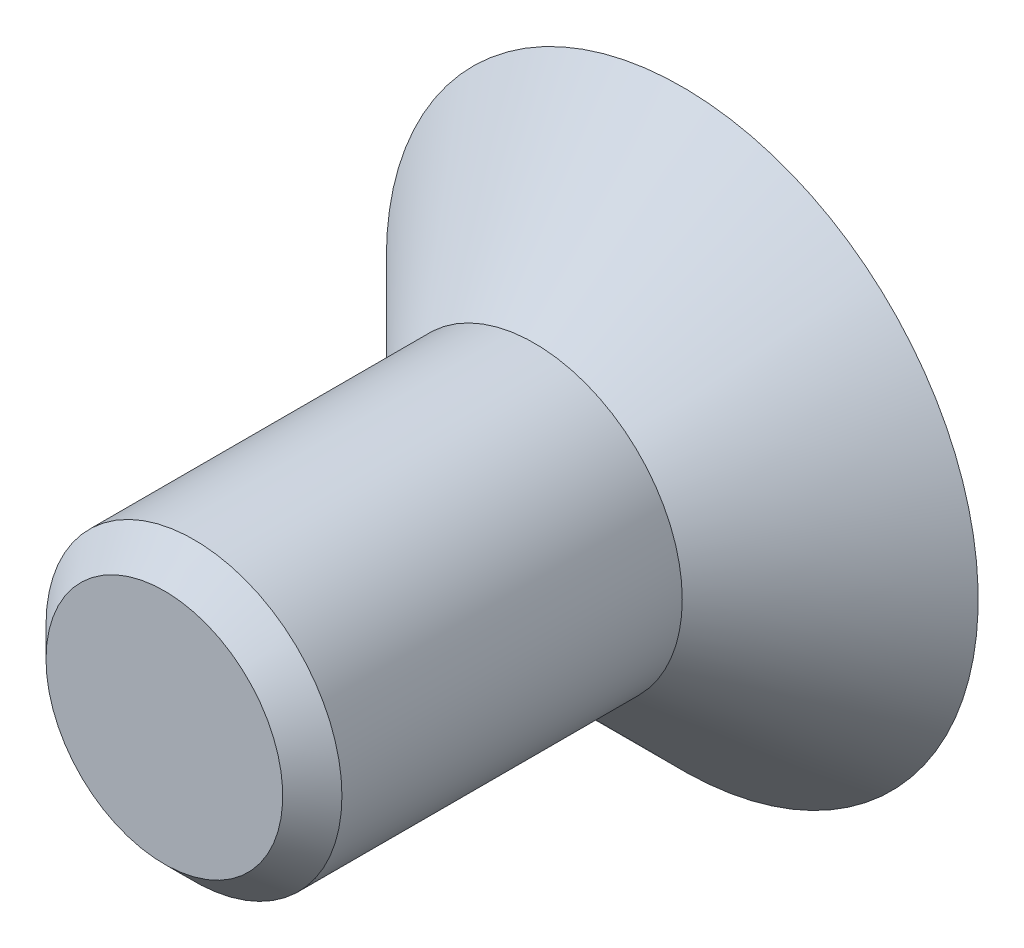
ISO-10303-21;
HEADER;
FILE_DESCRIPTION(('STEP AP214'),'2;1');
FILE_NAME('part.step','',(''),(''),'','','');
FILE_SCHEMA(('AUTOMOTIVE_DESIGN { 1 0 10303 214 1 1 1 1 }'));
ENDSEC;
DATA;
#1=APPLICATION_CONTEXT('core data for automotive mechanical design processes');
#2=APPLICATION_PROTOCOL_DEFINITION('international standard','automotive_design',2000,#1);
#3=PRODUCT_CONTEXT('',#1,'mechanical');
#4=PRODUCT('Part','Part','',(#3));
#5=PRODUCT_RELATED_PRODUCT_CATEGORY('part','',(#4));
#6=PRODUCT_DEFINITION_FORMATION('','',#4);
#7=PRODUCT_DEFINITION_CONTEXT('part definition',#1,'design');
#8=PRODUCT_DEFINITION('design','',#6,#7);
#9=PRODUCT_DEFINITION_SHAPE('','',#8);
#10=(LENGTH_UNIT() NAMED_UNIT(*) SI_UNIT(.MILLI.,.METRE.));
#11=(NAMED_UNIT(*) PLANE_ANGLE_UNIT() SI_UNIT($,.RADIAN.));
#12=(NAMED_UNIT(*) SI_UNIT($,.STERADIAN.) SOLID_ANGLE_UNIT());
#13=UNCERTAINTY_MEASURE_WITH_UNIT(LENGTH_MEASURE(1.E-05),#10,'distance_accuracy_value','');
#14=(GEOMETRIC_REPRESENTATION_CONTEXT(3) GLOBAL_UNCERTAINTY_ASSIGNED_CONTEXT((#13)) GLOBAL_UNIT_ASSIGNED_CONTEXT((#10,
#11,#12)) REPRESENTATION_CONTEXT('',''));
#15=CARTESIAN_POINT('',(0.,0.,0.));
#16=DIRECTION('',(0.,0.,1.));
#17=DIRECTION('',(1.,0.,0.));
#18=AXIS2_PLACEMENT_3D('',#15,#16,#17);
#19=CARTESIAN_POINT('',(0.,0.,14.));
#20=DIRECTION('',(0.,0.,1.));
#21=DIRECTION('',(1.,0.,0.));
#22=AXIS2_PLACEMENT_3D('',#19,#20,#21);
#23=PLANE('',#22);
#24=CARTESIAN_POINT('',(0.,0.,14.00000000001));
#25=DIRECTION('',(0.,0.,-1.));
#26=DIRECTION('',(-1.,0.,0.));
#27=AXIS2_PLACEMENT_3D('',#24,#25,#26);
#28=CIRCLE('',#27,3.1999999999357);
#29=CARTESIAN_POINT('',(-3.1999999999357,0.,14.00000000001));
#30=VERTEX_POINT('',#29);
#31=EDGE_CURVE('E20',#30,#30,#28,.T.);
#32=ORIENTED_EDGE('',*,*,#31,.F.);
#33=EDGE_LOOP('',(#32));
#34=FACE_BOUND('',#33,.T.);
#35=ADVANCED_FACE('F17',(#34),#23,.T.);
#36=CARTESIAN_POINT('',(0.,0.,13.2000000000403));
#37=DIRECTION('',(0.,0.,-1.));
#38=DIRECTION('',(-1.,0.,0.));
#39=AXIS2_PLACEMENT_3D('',#36,#37,#38);
#40=CONICAL_SURFACE('',#39,3.99999999990541,0.785398163397448);
#41=CARTESIAN_POINT('',(0.,0.,13.2));
#42=DIRECTION('',(0.,0.,1.));
#43=DIRECTION('',(1.,0.,0.));
#44=AXIS2_PLACEMENT_3D('',#41,#42,#43);
#45=CIRCLE('',#44,4.);
#46=CARTESIAN_POINT('',(4.,0.,13.2));
#47=VERTEX_POINT('',#46);
#48=EDGE_CURVE('E103',#47,#47,#45,.F.);
#49=ORIENTED_EDGE('',*,*,#48,.F.);
#50=EDGE_LOOP('',(#49));
#51=FACE_BOUND('',#50,.T.);
#52=ORIENTED_EDGE('',*,*,#31,.T.);
#53=EDGE_LOOP('',(#52));
#54=FACE_BOUND('',#53,.T.);
#55=ADVANCED_FACE('F192',(#51,#54),#40,.T.);
#56=CARTESIAN_POINT('',(0.,0.,0.));
#57=DIRECTION('',(0.,0.,1.));
#58=DIRECTION('',(1.,0.,0.));
#59=AXIS2_PLACEMENT_3D('',#56,#57,#58);
#60=CYLINDRICAL_SURFACE('',#59,4.);
#61=ORIENTED_EDGE('',*,*,#48,.T.);
#62=EDGE_LOOP('',(#61));
#63=FACE_BOUND('',#62,.T.);
#64=CARTESIAN_POINT('',(0.,0.,4.));
#65=DIRECTION('',(0.,0.,-1.));
#66=DIRECTION('',(0.,-1.,0.));
#67=AXIS2_PLACEMENT_3D('',#64,#65,#66);
#68=CIRCLE('',#67,4.);
#69=CARTESIAN_POINT('',(0.,-4.,4.));
#70=VERTEX_POINT('',#69);
#71=EDGE_CURVE('E80',#70,#70,#68,.T.);
#72=ORIENTED_EDGE('',*,*,#71,.F.);
#73=EDGE_LOOP('',(#72));
#74=FACE_BOUND('',#73,.T.);
#75=ADVANCED_FACE('F190',(#63,#74),#60,.T.);
#76=CARTESIAN_POINT('',(0.,0.,4.));
#77=DIRECTION('',(0.,0.,1.));
#78=DIRECTION('',(1.,0.,0.));
#79=AXIS2_PLACEMENT_3D('',#76,#77,#78);
#80=PLANE('',#79);
#81=DIRECTION('',(-0.866025403784439,-0.5,0.));
#82=VECTOR('',#81,1.);
#83=CARTESIAN_POINT('',(-2.5,1.44337567297406,4.));
#84=LINE('',#83,#82);
#85=CARTESIAN_POINT('',(-2.5,1.44337567297406,4.));
#86=VERTEX_POINT('',#85);
#87=CARTESIAN_POINT('',(0.,2.88675134594813,4.));
#88=VERTEX_POINT('',#87);
#89=EDGE_CURVE('E130',#86,#88,#84,.F.);
#90=ORIENTED_EDGE('',*,*,#89,.T.);
#91=DIRECTION('',(-0.866025403784439,0.5,0.));
#92=VECTOR('',#91,1.);
#93=CARTESIAN_POINT('',(0.,2.88675134594813,4.));
#94=LINE('',#93,#92);
#95=CARTESIAN_POINT('',(2.5,1.44337567297406,4.));
#96=VERTEX_POINT('',#95);
#97=EDGE_CURVE('E123',#88,#96,#94,.F.);
#98=ORIENTED_EDGE('',*,*,#97,.T.);
#99=DIRECTION('',(0.,1.,0.));
#100=VECTOR('',#99,1.);
#101=CARTESIAN_POINT('',(2.5,1.44337567297406,4.));
#102=LINE('',#101,#100);
#103=CARTESIAN_POINT('',(2.5,-1.44337567297406,4.));
#104=VERTEX_POINT('',#103);
#105=EDGE_CURVE('E73',#96,#104,#102,.F.);
#106=ORIENTED_EDGE('',*,*,#105,.T.);
#107=DIRECTION('',(0.866025403784439,0.499999999999999,0.));
#108=VECTOR('',#107,1.);
#109=CARTESIAN_POINT('',(2.5,-1.44337567297406,4.));
#110=LINE('',#109,#108);
#111=CARTESIAN_POINT('',(0.,-2.88675134594813,4.));
#112=VERTEX_POINT('',#111);
#113=EDGE_CURVE('E71',#104,#112,#110,.F.);
#114=ORIENTED_EDGE('',*,*,#113,.T.);
#115=DIRECTION('',(0.866025403784438,-0.5,0.));
#116=VECTOR('',#115,1.);
#117=CARTESIAN_POINT('',(0.,-2.88675134594813,4.));
#118=LINE('',#117,#116);
#119=CARTESIAN_POINT('',(-2.5,-1.44337567297406,4.));
#120=VERTEX_POINT('',#119);
#121=EDGE_CURVE('E68',#112,#120,#118,.F.);
#122=ORIENTED_EDGE('',*,*,#121,.T.);
#123=DIRECTION('',(0.,1.,0.));
#124=VECTOR('',#123,1.);
#125=CARTESIAN_POINT('',(-2.5,-1.44337567297406,4.));
#126=LINE('',#125,#124);
#127=EDGE_CURVE('E137',#120,#86,#126,.T.);
#128=ORIENTED_EDGE('',*,*,#127,.T.);
#129=EDGE_LOOP('',(#90,#98,#106,#114,#122,#128));
#130=FACE_BOUND('',#129,.T.);
#131=ADVANCED_FACE('F72',(#130),#80,.F.);
#132=CARTESIAN_POINT('',(0.,0.,0.));
#133=DIRECTION('',(0.,0.,-1.));
#134=DIRECTION('',(-1.,0.,0.));
#135=AXIS2_PLACEMENT_3D('',#132,#133,#134);
#136=CONICAL_SURFACE('',#135,8.,0.785398163397448);
#137=CARTESIAN_POINT('',(0.,0.,0.));
#138=DIRECTION('',(0.,0.,-1.));
#139=DIRECTION('',(-1.,0.,0.));
#140=AXIS2_PLACEMENT_3D('',#137,#138,#139);
#141=CIRCLE('',#140,8.);
#142=CARTESIAN_POINT('',(-8.,0.,0.));
#143=VERTEX_POINT('',#142);
#144=EDGE_CURVE('E106',#143,#143,#141,.F.);
#145=ORIENTED_EDGE('',*,*,#144,.T.);
#146=EDGE_LOOP('',(#145));
#147=FACE_BOUND('',#146,.T.);
#148=ORIENTED_EDGE('',*,*,#71,.T.);
#149=EDGE_LOOP('',(#148));
#150=FACE_BOUND('',#149,.T.);
#151=ADVANCED_FACE('F185',(#147,#150),#136,.T.);
#152=CARTESIAN_POINT('',(2.5,-1.44337567297406,0.));
#153=DIRECTION('',(0.499999999999999,-0.866025403784439,0.));
#154=DIRECTION('',(0.866025403784439,0.499999999999999,0.));
#155=AXIS2_PLACEMENT_3D('',#152,#153,#154);
#156=PLANE('',#155);
#157=ORIENTED_EDGE('',*,*,#113,.F.);
#158=DIRECTION('',(0.,0.,-1.));
#159=VECTOR('',#158,1.);
#160=CARTESIAN_POINT('',(2.5,-1.44337567297406,0.));
#161=LINE('',#160,#159);
#162=CARTESIAN_POINT('',(2.5,-1.44337567297406,0.));
#163=VERTEX_POINT('',#162);
#164=EDGE_CURVE('E109',#104,#163,#161,.T.);
#165=ORIENTED_EDGE('',*,*,#164,.T.);
#166=DIRECTION('',(-0.866025403784438,-0.500000000000001,0.));
#167=VECTOR('',#166,1.);
#168=CARTESIAN_POINT('',(2.5,-1.44337567297406,0.));
#169=LINE('',#168,#167);
#170=CARTESIAN_POINT('',(0.,-2.88675134594813,0.));
#171=VERTEX_POINT('',#170);
#172=EDGE_CURVE('E92',#163,#171,#169,.T.);
#173=ORIENTED_EDGE('',*,*,#172,.T.);
#174=DIRECTION('',(0.,0.,1.));
#175=VECTOR('',#174,1.);
#176=CARTESIAN_POINT('',(0.,-2.88675134594813,0.));
#177=LINE('',#176,#175);
#178=EDGE_CURVE('E79',#171,#112,#177,.T.);
#179=ORIENTED_EDGE('',*,*,#178,.T.);
#180=EDGE_LOOP('',(#157,#165,#173,#179));
#181=FACE_BOUND('',#180,.T.);
#182=ADVANCED_FACE('F91',(#181),#156,.F.);
#183=CARTESIAN_POINT('',(0.,-2.88675134594813,0.));
#184=DIRECTION('',(-0.5,-0.866025403784438,0.));
#185=DIRECTION('',(0.866025403784438,-0.5,0.));
#186=AXIS2_PLACEMENT_3D('',#183,#184,#185);
#187=PLANE('',#186);
#188=ORIENTED_EDGE('',*,*,#121,.F.);
#189=ORIENTED_EDGE('',*,*,#178,.F.);
#190=DIRECTION('',(-0.866025403784438,0.500000000000001,0.));
#191=VECTOR('',#190,1.);
#192=CARTESIAN_POINT('',(0.,-2.88675134594813,0.));
#193=LINE('',#192,#191);
#194=CARTESIAN_POINT('',(-2.5,-1.44337567297406,0.));
#195=VERTEX_POINT('',#194);
#196=EDGE_CURVE('E114',#171,#195,#193,.T.);
#197=ORIENTED_EDGE('',*,*,#196,.T.);
#198=DIRECTION('',(0.,0.,1.));
#199=VECTOR('',#198,1.);
#200=CARTESIAN_POINT('',(-2.5,-1.44337567297406,0.));
#201=LINE('',#200,#199);
#202=EDGE_CURVE('E87',#195,#120,#201,.T.);
#203=ORIENTED_EDGE('',*,*,#202,.T.);
#204=EDGE_LOOP('',(#188,#189,#197,#203));
#205=FACE_BOUND('',#204,.T.);
#206=ADVANCED_FACE('F84',(#205),#187,.F.);
#207=CARTESIAN_POINT('',(-2.5,-1.44337567297406,0.));
#208=DIRECTION('',(-1.,0.,0.));
#209=DIRECTION('',(0.,0.,1.));
#210=AXIS2_PLACEMENT_3D('',#207,#208,#209);
#211=PLANE('',#210);
#212=ORIENTED_EDGE('',*,*,#127,.F.);
#213=ORIENTED_EDGE('',*,*,#202,.F.);
#214=DIRECTION('',(0.,1.,0.));
#215=VECTOR('',#214,1.);
#216=CARTESIAN_POINT('',(-2.5,4.,0.));
#217=LINE('',#216,#215);
#218=CARTESIAN_POINT('',(-2.5,1.44337567297406,0.));
#219=VERTEX_POINT('',#218);
#220=EDGE_CURVE('E142',#195,#219,#217,.T.);
#221=ORIENTED_EDGE('',*,*,#220,.T.);
#222=DIRECTION('',(0.,0.,1.));
#223=VECTOR('',#222,1.);
#224=CARTESIAN_POINT('',(-2.5,1.44337567297406,0.));
#225=LINE('',#224,#223);
#226=EDGE_CURVE('E133',#219,#86,#225,.T.);
#227=ORIENTED_EDGE('',*,*,#226,.T.);
#228=EDGE_LOOP('',(#212,#213,#221,#227));
#229=FACE_BOUND('',#228,.T.);
#230=ADVANCED_FACE('F166',(#229),#211,.F.);
#231=CARTESIAN_POINT('',(-2.5,1.44337567297406,0.));
#232=DIRECTION('',(-0.5,0.866025403784439,0.));
#233=DIRECTION('',(-0.866025403784439,-0.5,0.));
#234=AXIS2_PLACEMENT_3D('',#231,#232,#233);
#235=PLANE('',#234);
#236=ORIENTED_EDGE('',*,*,#89,.F.);
#237=ORIENTED_EDGE('',*,*,#226,.F.);
#238=DIRECTION('',(0.866025403784438,0.500000000000001,0.));
#239=VECTOR('',#238,1.);
#240=CARTESIAN_POINT('',(-2.5,1.44337567297406,0.));
#241=LINE('',#240,#239);
#242=CARTESIAN_POINT('',(0.,2.88675134594813,0.));
#243=VERTEX_POINT('',#242);
#244=EDGE_CURVE('E145',#219,#243,#241,.T.);
#245=ORIENTED_EDGE('',*,*,#244,.T.);
#246=DIRECTION('',(0.,0.,1.));
#247=VECTOR('',#246,1.);
#248=CARTESIAN_POINT('',(0.,2.88675134594813,0.));
#249=LINE('',#248,#247);
#250=EDGE_CURVE('E126',#243,#88,#249,.T.);
#251=ORIENTED_EDGE('',*,*,#250,.T.);
#252=EDGE_LOOP('',(#236,#237,#245,#251));
#253=FACE_BOUND('',#252,.T.);
#254=ADVANCED_FACE('F164',(#253),#235,.F.);
#255=CARTESIAN_POINT('',(0.,2.88675134594813,0.));
#256=DIRECTION('',(0.5,0.866025403784439,0.));
#257=DIRECTION('',(-0.866025403784439,0.5,0.));
#258=AXIS2_PLACEMENT_3D('',#255,#256,#257);
#259=PLANE('',#258);
#260=ORIENTED_EDGE('',*,*,#97,.F.);
#261=ORIENTED_EDGE('',*,*,#250,.F.);
#262=DIRECTION('',(0.866025403784438,-0.500000000000001,0.));
#263=VECTOR('',#262,1.);
#264=CARTESIAN_POINT('',(0.,2.88675134594813,0.));
#265=LINE('',#264,#263);
#266=CARTESIAN_POINT('',(2.5,1.44337567297406,0.));
#267=VERTEX_POINT('',#266);
#268=EDGE_CURVE('E27',#243,#267,#265,.T.);
#269=ORIENTED_EDGE('',*,*,#268,.T.);
#270=DIRECTION('',(0.,0.,-1.));
#271=VECTOR('',#270,1.);
#272=CARTESIAN_POINT('',(2.5,1.44337567297406,0.));
#273=LINE('',#272,#271);
#274=EDGE_CURVE('E35',#267,#96,#273,.F.);
#275=ORIENTED_EDGE('',*,*,#274,.T.);
#276=EDGE_LOOP('',(#260,#261,#269,#275));
#277=FACE_BOUND('',#276,.T.);
#278=ADVANCED_FACE('F156',(#277),#259,.F.);
#279=CARTESIAN_POINT('',(2.5,1.44337567297406,0.));
#280=DIRECTION('',(1.,0.,0.));
#281=DIRECTION('',(0.,0.,-1.));
#282=AXIS2_PLACEMENT_3D('',#279,#280,#281);
#283=PLANE('',#282);
#284=ORIENTED_EDGE('',*,*,#105,.F.);
#285=ORIENTED_EDGE('',*,*,#274,.F.);
#286=DIRECTION('',(0.,1.,0.));
#287=VECTOR('',#286,1.);
#288=CARTESIAN_POINT('',(2.5,4.,0.));
#289=LINE('',#288,#287);
#290=EDGE_CURVE('E11',#267,#163,#289,.F.);
#291=ORIENTED_EDGE('',*,*,#290,.T.);
#292=ORIENTED_EDGE('',*,*,#164,.F.);
#293=EDGE_LOOP('',(#284,#285,#291,#292));
#294=FACE_BOUND('',#293,.T.);
#295=ADVANCED_FACE('F167',(#294),#283,.F.);
#296=CARTESIAN_POINT('',(0.,4.,0.));
#297=DIRECTION('',(0.,0.,1.));
#298=DIRECTION('',(1.,0.,0.));
#299=AXIS2_PLACEMENT_3D('',#296,#297,#298);
#300=PLANE('',#299);
#301=ORIENTED_EDGE('',*,*,#268,.F.);
#302=ORIENTED_EDGE('',*,*,#244,.F.);
#303=ORIENTED_EDGE('',*,*,#220,.F.);
#304=ORIENTED_EDGE('',*,*,#196,.F.);
#305=ORIENTED_EDGE('',*,*,#172,.F.);
#306=ORIENTED_EDGE('',*,*,#290,.F.);
#307=EDGE_LOOP('',(#301,#302,#303,#304,#305,#306));
#308=FACE_BOUND('',#307,.T.);
#309=ORIENTED_EDGE('',*,*,#144,.F.);
#310=EDGE_LOOP('',(#309));
#311=FACE_BOUND('',#310,.T.);
#312=ADVANCED_FACE('F159',(#308,#311),#300,.F.);
#313=CLOSED_SHELL('',(#35,#55,#75,#131,#151,#182,#206,#230,#254,#278,#295,#312));
#314=MANIFOLD_SOLID_BREP('B1',#313);
#315=ADVANCED_BREP_SHAPE_REPRESENTATION('',(#18,#314),#14);
#316=SHAPE_DEFINITION_REPRESENTATION(#9,#315);
ENDSEC;
END-ISO-10303-21;
